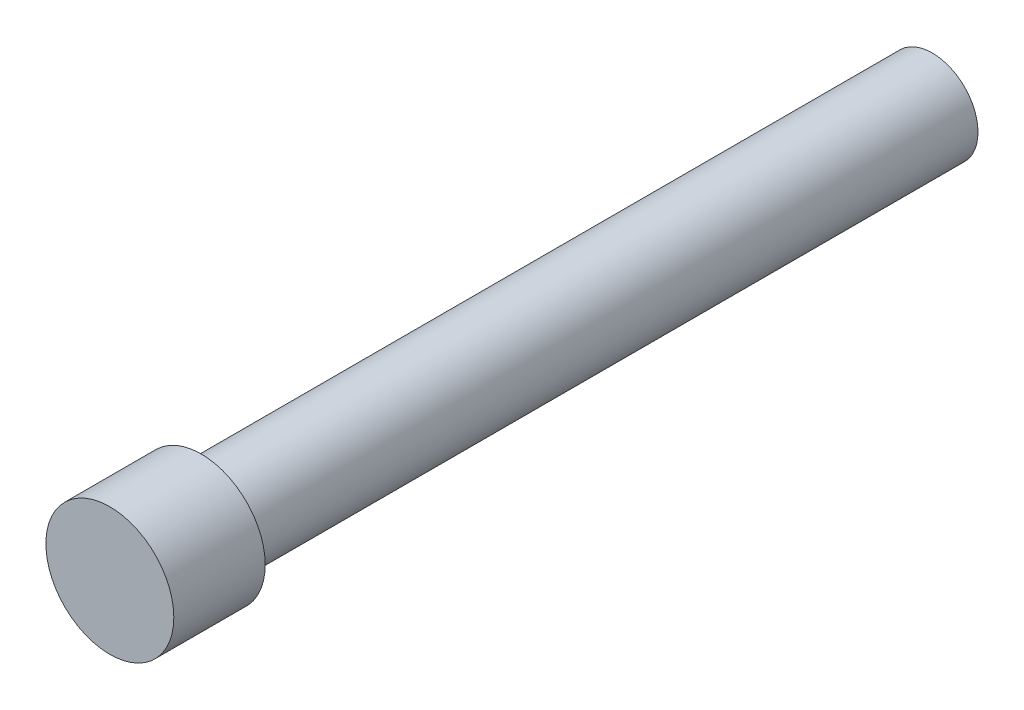
ISO-10303-21;
HEADER;
FILE_DESCRIPTION(('STEP AP214'),'2;1');
FILE_NAME('part.step','',(''),(''),'','','');
FILE_SCHEMA(('AUTOMOTIVE_DESIGN { 1 0 10303 214 1 1 1 1 }'));
ENDSEC;
DATA;
#1=APPLICATION_CONTEXT('core data for automotive mechanical design processes');
#2=APPLICATION_PROTOCOL_DEFINITION('international standard','automotive_design',2000,#1);
#3=PRODUCT_CONTEXT('',#1,'mechanical');
#4=PRODUCT('Part','Part','',(#3));
#5=PRODUCT_RELATED_PRODUCT_CATEGORY('part','',(#4));
#6=PRODUCT_DEFINITION_FORMATION('','',#4);
#7=PRODUCT_DEFINITION_CONTEXT('part definition',#1,'design');
#8=PRODUCT_DEFINITION('design','',#6,#7);
#9=PRODUCT_DEFINITION_SHAPE('','',#8);
#10=(LENGTH_UNIT() NAMED_UNIT(*) SI_UNIT(.MILLI.,.METRE.));
#11=(NAMED_UNIT(*) PLANE_ANGLE_UNIT() SI_UNIT($,.RADIAN.));
#12=(NAMED_UNIT(*) SI_UNIT($,.STERADIAN.) SOLID_ANGLE_UNIT());
#13=UNCERTAINTY_MEASURE_WITH_UNIT(LENGTH_MEASURE(1.E-05),#10,'distance_accuracy_value','');
#14=(GEOMETRIC_REPRESENTATION_CONTEXT(3) GLOBAL_UNCERTAINTY_ASSIGNED_CONTEXT((#13)) GLOBAL_UNIT_ASSIGNED_CONTEXT((#10,
#11,#12)) REPRESENTATION_CONTEXT('',''));
#15=CARTESIAN_POINT('',(0.,0.,0.));
#16=DIRECTION('',(0.,0.,1.));
#17=DIRECTION('',(1.,0.,0.));
#18=AXIS2_PLACEMENT_3D('',#15,#16,#17);
#19=CARTESIAN_POINT('',(0.,0.,80.));
#20=DIRECTION('',(0.,0.,-1.));
#21=DIRECTION('',(-1.,0.,0.));
#22=AXIS2_PLACEMENT_3D('',#19,#20,#21);
#23=CYLINDRICAL_SURFACE('',#22,5.);
#24=CARTESIAN_POINT('',(0.,0.,80.));
#25=DIRECTION('',(0.,0.,1.));
#26=DIRECTION('',(1.,0.,0.));
#27=AXIS2_PLACEMENT_3D('',#24,#25,#26);
#28=CIRCLE('',#27,5.);
#29=CARTESIAN_POINT('',(5.,0.,80.));
#30=VERTEX_POINT('',#29);
#31=EDGE_CURVE('E10',#30,#30,#28,.T.);
#32=ORIENTED_EDGE('',*,*,#31,.F.);
#33=EDGE_LOOP('',(#32));
#34=FACE_BOUND('',#33,.T.);
#35=CARTESIAN_POINT('',(0.,0.,0.));
#36=DIRECTION('',(0.,0.,1.));
#37=DIRECTION('',(1.,0.,0.));
#38=AXIS2_PLACEMENT_3D('',#35,#36,#37);
#39=CIRCLE('',#38,5.);
#40=CARTESIAN_POINT('',(5.,0.,0.));
#41=VERTEX_POINT('',#40);
#42=EDGE_CURVE('E40',#41,#41,#39,.T.);
#43=ORIENTED_EDGE('',*,*,#42,.T.);
#44=EDGE_LOOP('',(#43));
#45=FACE_BOUND('',#44,.T.);
#46=ADVANCED_FACE('F37',(#34,#45),#23,.T.);
#47=CARTESIAN_POINT('',(0.,0.,0.));
#48=DIRECTION('',(0.,0.,1.));
#49=DIRECTION('',(1.,0.,0.));
#50=AXIS2_PLACEMENT_3D('',#47,#48,#49);
#51=PLANE('',#50);
#52=ORIENTED_EDGE('',*,*,#42,.F.);
#53=EDGE_LOOP('',(#52));
#54=FACE_BOUND('',#53,.T.);
#55=ADVANCED_FACE('F64',(#54),#51,.F.);
#56=CARTESIAN_POINT('',(0.,0.,90.));
#57=DIRECTION('',(0.,0.,-1.));
#58=DIRECTION('',(-1.,0.,0.));
#59=AXIS2_PLACEMENT_3D('',#56,#57,#58);
#60=CYLINDRICAL_SURFACE('',#59,7.);
#61=CARTESIAN_POINT('',(0.,0.,90.));
#62=DIRECTION('',(0.,0.,1.));
#63=DIRECTION('',(1.,0.,0.));
#64=AXIS2_PLACEMENT_3D('',#61,#62,#63);
#65=CIRCLE('',#64,7.);
#66=CARTESIAN_POINT('',(7.,0.,90.));
#67=VERTEX_POINT('',#66);
#68=EDGE_CURVE('E49',#67,#67,#65,.T.);
#69=ORIENTED_EDGE('',*,*,#68,.F.);
#70=EDGE_LOOP('',(#69));
#71=FACE_BOUND('',#70,.T.);
#72=CARTESIAN_POINT('',(0.,0.,80.));
#73=DIRECTION('',(0.,0.,1.));
#74=DIRECTION('',(1.,0.,0.));
#75=AXIS2_PLACEMENT_3D('',#72,#73,#74);
#76=CIRCLE('',#75,7.);
#77=CARTESIAN_POINT('',(7.,0.,80.));
#78=VERTEX_POINT('',#77);
#79=EDGE_CURVE('E51',#78,#78,#76,.T.);
#80=ORIENTED_EDGE('',*,*,#79,.T.);
#81=EDGE_LOOP('',(#80));
#82=FACE_BOUND('',#81,.T.);
#83=ADVANCED_FACE('F61',(#71,#82),#60,.T.);
#84=CARTESIAN_POINT('',(0.,0.,90.));
#85=DIRECTION('',(0.,0.,1.));
#86=DIRECTION('',(1.,0.,0.));
#87=AXIS2_PLACEMENT_3D('',#84,#85,#86);
#88=PLANE('',#87);
#89=ORIENTED_EDGE('',*,*,#68,.T.);
#90=EDGE_LOOP('',(#89));
#91=FACE_BOUND('',#90,.T.);
#92=ADVANCED_FACE('F59',(#91),#88,.T.);
#93=CARTESIAN_POINT('',(0.,0.,80.));
#94=DIRECTION('',(0.,0.,1.));
#95=DIRECTION('',(1.,0.,0.));
#96=AXIS2_PLACEMENT_3D('',#93,#94,#95);
#97=PLANE('',#96);
#98=ORIENTED_EDGE('',*,*,#31,.T.);
#99=EDGE_LOOP('',(#98));
#100=FACE_BOUND('',#99,.T.);
#101=ORIENTED_EDGE('',*,*,#79,.F.);
#102=EDGE_LOOP('',(#101));
#103=FACE_BOUND('',#102,.T.);
#104=ADVANCED_FACE('F68',(#100,#103),#97,.F.);
#105=CLOSED_SHELL('',(#46,#55,#83,#92,#104));
#106=MANIFOLD_SOLID_BREP('B2',#105);
#107=ADVANCED_BREP_SHAPE_REPRESENTATION('',(#18,#106),#14);
#108=SHAPE_DEFINITION_REPRESENTATION(#9,#107);
ENDSEC;
END-ISO-10303-21;
